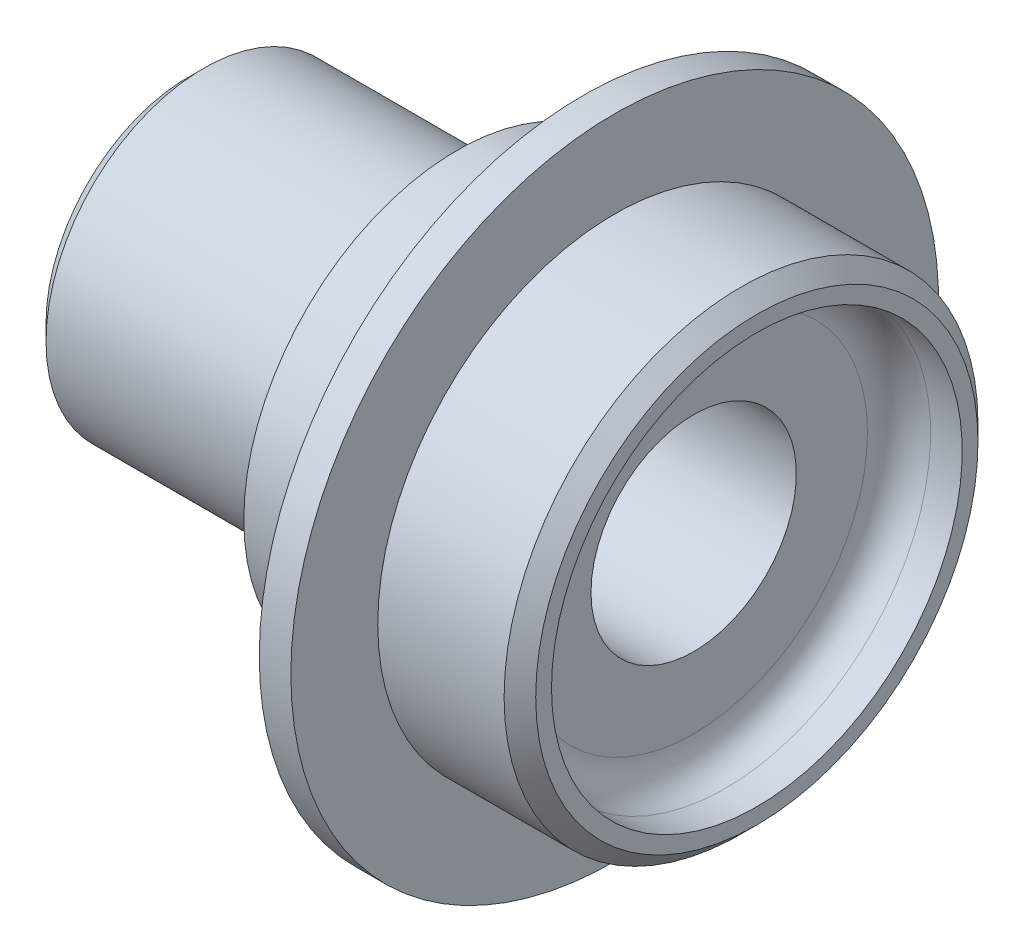
ISO-10303-21;
HEADER;
FILE_DESCRIPTION(('STEP AP214'),'2;1');
FILE_NAME('part.step','',(''),(''),'','','');
FILE_SCHEMA(('AUTOMOTIVE_DESIGN { 1 0 10303 214 1 1 1 1 }'));
ENDSEC;
DATA;
#1=APPLICATION_CONTEXT('core data for automotive mechanical design processes');
#2=APPLICATION_PROTOCOL_DEFINITION('international standard','automotive_design',2000,#1);
#3=PRODUCT_CONTEXT('',#1,'mechanical');
#4=PRODUCT('Part','Part','',(#3));
#5=PRODUCT_RELATED_PRODUCT_CATEGORY('part','',(#4));
#6=PRODUCT_DEFINITION_FORMATION('','',#4);
#7=PRODUCT_DEFINITION_CONTEXT('part definition',#1,'design');
#8=PRODUCT_DEFINITION('design','',#6,#7);
#9=PRODUCT_DEFINITION_SHAPE('','',#8);
#10=(LENGTH_UNIT() NAMED_UNIT(*) SI_UNIT(.MILLI.,.METRE.));
#11=(NAMED_UNIT(*) PLANE_ANGLE_UNIT() SI_UNIT($,.RADIAN.));
#12=(NAMED_UNIT(*) SI_UNIT($,.STERADIAN.) SOLID_ANGLE_UNIT());
#13=UNCERTAINTY_MEASURE_WITH_UNIT(LENGTH_MEASURE(1.E-05),#10,'distance_accuracy_value','');
#14=(GEOMETRIC_REPRESENTATION_CONTEXT(3) GLOBAL_UNCERTAINTY_ASSIGNED_CONTEXT((#13)) GLOBAL_UNIT_ASSIGNED_CONTEXT((#10,
#11,#12)) REPRESENTATION_CONTEXT('',''));
#15=CARTESIAN_POINT('',(0.,0.,0.));
#16=DIRECTION('',(0.,0.,1.));
#17=DIRECTION('',(1.,0.,0.));
#18=AXIS2_PLACEMENT_3D('',#15,#16,#17);
#19=CARTESIAN_POINT('',(0.,0.,0.));
#20=DIRECTION('',(-1.,0.,0.));
#21=DIRECTION('',(0.,0.,1.));
#22=AXIS2_PLACEMENT_3D('',#19,#20,#21);
#23=CYLINDRICAL_SURFACE('',#22,8.);
#24=CARTESIAN_POINT('',(10.,0.,0.));
#25=DIRECTION('',(-1.,0.,0.));
#26=DIRECTION('',(0.,0.,1.));
#27=AXIS2_PLACEMENT_3D('',#24,#25,#26);
#28=CIRCLE('',#27,8.);
#29=CARTESIAN_POINT('',(10.,0.,8.));
#30=VERTEX_POINT('',#29);
#31=EDGE_CURVE('E66',#30,#30,#28,.T.);
#32=ORIENTED_EDGE('',*,*,#31,.F.);
#33=EDGE_LOOP('',(#32));
#34=FACE_BOUND('',#33,.T.);
#35=CARTESIAN_POINT('',(0.,0.,0.));
#36=DIRECTION('',(-1.,0.,0.));
#37=DIRECTION('',(0.,0.,1.));
#38=AXIS2_PLACEMENT_3D('',#35,#36,#37);
#39=CIRCLE('',#38,8.);
#40=CARTESIAN_POINT('',(0.,0.,8.));
#41=VERTEX_POINT('',#40);
#42=EDGE_CURVE('E122',#41,#41,#39,.T.);
#43=ORIENTED_EDGE('',*,*,#42,.T.);
#44=EDGE_LOOP('',(#43));
#45=FACE_BOUND('',#44,.T.);
#46=ADVANCED_FACE('F41',(#34,#45),#23,.F.);
#47=CARTESIAN_POINT('',(10.,5.5,0.));
#48=DIRECTION('',(1.,0.,0.));
#49=DIRECTION('',(0.,0.,-1.));
#50=AXIS2_PLACEMENT_3D('',#47,#48,#49);
#51=PLANE('',#50);
#52=CARTESIAN_POINT('',(10.,0.,0.));
#53=DIRECTION('',(-1.,0.,0.));
#54=DIRECTION('',(0.,0.,1.));
#55=AXIS2_PLACEMENT_3D('',#52,#53,#54);
#56=CIRCLE('',#55,5.5);
#57=CARTESIAN_POINT('',(10.,0.,5.5));
#58=VERTEX_POINT('',#57);
#59=EDGE_CURVE('E70',#58,#58,#56,.T.);
#60=ORIENTED_EDGE('',*,*,#59,.F.);
#61=EDGE_LOOP('',(#60));
#62=FACE_BOUND('',#61,.T.);
#63=ORIENTED_EDGE('',*,*,#31,.T.);
#64=EDGE_LOOP('',(#63));
#65=FACE_BOUND('',#64,.T.);
#66=ADVANCED_FACE('F143',(#62,#65),#51,.F.);
#67=CARTESIAN_POINT('',(0.,0.,0.));
#68=DIRECTION('',(-1.,0.,0.));
#69=DIRECTION('',(0.,0.,1.));
#70=AXIS2_PLACEMENT_3D('',#67,#68,#69);
#71=CYLINDRICAL_SURFACE('',#70,5.5);
#72=CARTESIAN_POINT('',(12.,0.,0.));
#73=DIRECTION('',(-1.,0.,0.));
#74=DIRECTION('',(0.,0.,1.));
#75=AXIS2_PLACEMENT_3D('',#72,#73,#74);
#76=CIRCLE('',#75,5.5);
#77=CARTESIAN_POINT('',(12.,0.,5.5));
#78=VERTEX_POINT('',#77);
#79=EDGE_CURVE('E74',#78,#78,#76,.T.);
#80=ORIENTED_EDGE('',*,*,#79,.F.);
#81=EDGE_LOOP('',(#80));
#82=FACE_BOUND('',#81,.T.);
#83=ORIENTED_EDGE('',*,*,#59,.T.);
#84=EDGE_LOOP('',(#83));
#85=FACE_BOUND('',#84,.T.);
#86=ADVANCED_FACE('F149',(#82,#85),#71,.F.);
#87=CARTESIAN_POINT('',(12.,6.5,0.));
#88=DIRECTION('',(-1.,0.,0.));
#89=DIRECTION('',(0.,0.,1.));
#90=AXIS2_PLACEMENT_3D('',#87,#88,#89);
#91=PLANE('',#90);
#92=CARTESIAN_POINT('',(12.,0.,0.));
#93=DIRECTION('',(-1.,0.,0.));
#94=DIRECTION('',(0.,0.,1.));
#95=AXIS2_PLACEMENT_3D('',#92,#93,#94);
#96=CIRCLE('',#95,6.5);
#97=CARTESIAN_POINT('',(12.,0.,6.5));
#98=VERTEX_POINT('',#97);
#99=EDGE_CURVE('E78',#98,#98,#96,.T.);
#100=ORIENTED_EDGE('',*,*,#99,.F.);
#101=EDGE_LOOP('',(#100));
#102=FACE_BOUND('',#101,.T.);
#103=ORIENTED_EDGE('',*,*,#79,.T.);
#104=EDGE_LOOP('',(#103));
#105=FACE_BOUND('',#104,.T.);
#106=ADVANCED_FACE('F161',(#102,#105),#91,.F.);
#107=CARTESIAN_POINT('',(0.,0.,0.));
#108=DIRECTION('',(-1.,0.,0.));
#109=DIRECTION('',(0.,0.,1.));
#110=AXIS2_PLACEMENT_3D('',#107,#108,#109);
#111=CYLINDRICAL_SURFACE('',#110,6.5);
#112=CARTESIAN_POINT('',(32.,0.,0.));
#113=DIRECTION('',(-1.,0.,0.));
#114=DIRECTION('',(0.,0.,1.));
#115=AXIS2_PLACEMENT_3D('',#112,#113,#114);
#116=CIRCLE('',#115,6.5);
#117=CARTESIAN_POINT('',(32.,0.,6.5));
#118=VERTEX_POINT('',#117);
#119=EDGE_CURVE('E82',#118,#118,#116,.T.);
#120=ORIENTED_EDGE('',*,*,#119,.F.);
#121=EDGE_LOOP('',(#120));
#122=FACE_BOUND('',#121,.T.);
#123=ORIENTED_EDGE('',*,*,#99,.T.);
#124=EDGE_LOOP('',(#123));
#125=FACE_BOUND('',#124,.T.);
#126=ADVANCED_FACE('F165',(#122,#125),#111,.F.);
#127=CARTESIAN_POINT('',(32.,11.,0.));
#128=DIRECTION('',(-1.,0.,0.));
#129=DIRECTION('',(0.,0.,1.));
#130=AXIS2_PLACEMENT_3D('',#127,#128,#129);
#131=PLANE('',#130);
#132=CARTESIAN_POINT('',(32.,0.,0.));
#133=DIRECTION('',(-1.,0.,0.));
#134=DIRECTION('',(0.,0.,1.));
#135=AXIS2_PLACEMENT_3D('',#132,#133,#134);
#136=CIRCLE('',#135,11.);
#137=CARTESIAN_POINT('',(32.,0.,11.));
#138=VERTEX_POINT('',#137);
#139=EDGE_CURVE('E86',#138,#138,#136,.T.);
#140=ORIENTED_EDGE('',*,*,#139,.F.);
#141=EDGE_LOOP('',(#140));
#142=FACE_BOUND('',#141,.T.);
#143=ORIENTED_EDGE('',*,*,#119,.T.);
#144=EDGE_LOOP('',(#143));
#145=FACE_BOUND('',#144,.T.);
#146=ADVANCED_FACE('F169',(#142,#145),#131,.F.);
#147=CARTESIAN_POINT('',(34.,0.,0.));
#148=DIRECTION('',(-1.,0.,0.));
#149=DIRECTION('',(0.,0.,1.));
#150=AXIS2_PLACEMENT_3D('',#147,#148,#149);
#151=TOROIDAL_SURFACE('',#150,11.,2.);
#152=CARTESIAN_POINT('',(34.,0.,0.));
#153=DIRECTION('',(-1.,0.,0.));
#154=DIRECTION('',(0.,0.,1.));
#155=AXIS2_PLACEMENT_3D('',#152,#153,#154);
#156=CIRCLE('',#155,13.);
#157=CARTESIAN_POINT('',(34.,0.,13.));
#158=VERTEX_POINT('',#157);
#159=EDGE_CURVE('E90',#158,#158,#156,.T.);
#160=ORIENTED_EDGE('',*,*,#159,.F.);
#161=EDGE_LOOP('',(#160));
#162=FACE_BOUND('',#161,.T.);
#163=ORIENTED_EDGE('',*,*,#139,.T.);
#164=EDGE_LOOP('',(#163));
#165=FACE_BOUND('',#164,.T.);
#166=ADVANCED_FACE('F173',(#162,#165),#151,.F.);
#167=CARTESIAN_POINT('',(0.,0.,0.));
#168=DIRECTION('',(-1.,0.,0.));
#169=DIRECTION('',(0.,0.,1.));
#170=AXIS2_PLACEMENT_3D('',#167,#168,#169);
#171=CYLINDRICAL_SURFACE('',#170,13.);
#172=CARTESIAN_POINT('',(36.,0.,0.));
#173=DIRECTION('',(-1.,0.,0.));
#174=DIRECTION('',(0.,0.,1.));
#175=AXIS2_PLACEMENT_3D('',#172,#173,#174);
#176=CIRCLE('',#175,13.);
#177=CARTESIAN_POINT('',(36.,0.,13.));
#178=VERTEX_POINT('',#177);
#179=EDGE_CURVE('E94',#178,#178,#176,.T.);
#180=ORIENTED_EDGE('',*,*,#179,.F.);
#181=EDGE_LOOP('',(#180));
#182=FACE_BOUND('',#181,.T.);
#183=ORIENTED_EDGE('',*,*,#159,.T.);
#184=EDGE_LOOP('',(#183));
#185=FACE_BOUND('',#184,.T.);
#186=ADVANCED_FACE('F177',(#182,#185),#171,.F.);
#187=CARTESIAN_POINT('',(36.,15.,0.));
#188=DIRECTION('',(-1.,0.,0.));
#189=DIRECTION('',(0.,0.,1.));
#190=AXIS2_PLACEMENT_3D('',#187,#188,#189);
#191=PLANE('',#190);
#192=CARTESIAN_POINT('',(36.,0.,0.));
#193=DIRECTION('',(-1.,0.,0.));
#194=DIRECTION('',(0.,0.,1.));
#195=AXIS2_PLACEMENT_3D('',#192,#193,#194);
#196=CIRCLE('',#195,14.);
#197=CARTESIAN_POINT('',(36.,0.,14.));
#198=VERTEX_POINT('',#197);
#199=EDGE_CURVE('E10',#198,#198,#196,.F.);
#200=ORIENTED_EDGE('',*,*,#199,.T.);
#201=EDGE_LOOP('',(#200));
#202=FACE_BOUND('',#201,.T.);
#203=ORIENTED_EDGE('',*,*,#179,.T.);
#204=EDGE_LOOP('',(#203));
#205=FACE_BOUND('',#204,.T.);
#206=ADVANCED_FACE('F181',(#202,#205),#191,.F.);
#207=CARTESIAN_POINT('',(0.,0.,0.));
#208=DIRECTION('',(-1.,0.,0.));
#209=DIRECTION('',(0.,0.,1.));
#210=AXIS2_PLACEMENT_3D('',#207,#208,#209);
#211=CYLINDRICAL_SURFACE('',#210,15.);
#212=CARTESIAN_POINT('',(35.,0.,0.));
#213=DIRECTION('',(-1.,0.,0.));
#214=DIRECTION('',(0.,0.,1.));
#215=AXIS2_PLACEMENT_3D('',#212,#213,#214);
#216=CIRCLE('',#215,15.);
#217=CARTESIAN_POINT('',(35.,0.,15.));
#218=VERTEX_POINT('',#217);
#219=EDGE_CURVE('E50',#218,#218,#216,.T.);
#220=ORIENTED_EDGE('',*,*,#219,.T.);
#221=EDGE_LOOP('',(#220));
#222=FACE_BOUND('',#221,.T.);
#223=CARTESIAN_POINT('',(27.,0.,0.));
#224=DIRECTION('',(-1.,0.,0.));
#225=DIRECTION('',(0.,0.,1.));
#226=AXIS2_PLACEMENT_3D('',#223,#224,#225);
#227=CIRCLE('',#226,15.);
#228=CARTESIAN_POINT('',(27.,0.,15.));
#229=VERTEX_POINT('',#228);
#230=EDGE_CURVE('E98',#229,#229,#227,.T.);
#231=ORIENTED_EDGE('',*,*,#230,.F.);
#232=EDGE_LOOP('',(#231));
#233=FACE_BOUND('',#232,.T.);
#234=ADVANCED_FACE('F185',(#222,#233),#211,.T.);
#235=CARTESIAN_POINT('',(27.,20.5,0.));
#236=DIRECTION('',(-1.,0.,0.));
#237=DIRECTION('',(0.,0.,1.));
#238=AXIS2_PLACEMENT_3D('',#235,#236,#237);
#239=PLANE('',#238);
#240=CARTESIAN_POINT('',(27.,0.,0.));
#241=DIRECTION('',(-1.,0.,0.));
#242=DIRECTION('',(0.,0.,1.));
#243=AXIS2_PLACEMENT_3D('',#240,#241,#242);
#244=CIRCLE('',#243,20.5);
#245=CARTESIAN_POINT('',(27.,0.,20.5));
#246=VERTEX_POINT('',#245);
#247=EDGE_CURVE('E102',#246,#246,#244,.T.);
#248=ORIENTED_EDGE('',*,*,#247,.F.);
#249=EDGE_LOOP('',(#248));
#250=FACE_BOUND('',#249,.T.);
#251=ORIENTED_EDGE('',*,*,#230,.T.);
#252=EDGE_LOOP('',(#251));
#253=FACE_BOUND('',#252,.T.);
#254=ADVANCED_FACE('F188',(#250,#253),#239,.F.);
#255=CARTESIAN_POINT('',(0.,0.,0.));
#256=DIRECTION('',(-1.,0.,0.));
#257=DIRECTION('',(0.,0.,1.));
#258=AXIS2_PLACEMENT_3D('',#255,#256,#257);
#259=CYLINDRICAL_SURFACE('',#258,20.5);
#260=CARTESIAN_POINT('',(25.,0.,0.));
#261=DIRECTION('',(-1.,0.,0.));
#262=DIRECTION('',(0.,0.,1.));
#263=AXIS2_PLACEMENT_3D('',#260,#261,#262);
#264=CIRCLE('',#263,20.5);
#265=CARTESIAN_POINT('',(25.,0.,20.5));
#266=VERTEX_POINT('',#265);
#267=EDGE_CURVE('E106',#266,#266,#264,.T.);
#268=ORIENTED_EDGE('',*,*,#267,.F.);
#269=EDGE_LOOP('',(#268));
#270=FACE_BOUND('',#269,.T.);
#271=ORIENTED_EDGE('',*,*,#247,.T.);
#272=EDGE_LOOP('',(#271));
#273=FACE_BOUND('',#272,.T.);
#274=ADVANCED_FACE('F191',(#270,#273),#259,.T.);
#275=CARTESIAN_POINT('',(25.,13.5,0.));
#276=DIRECTION('',(1.,0.,0.));
#277=DIRECTION('',(0.,0.,-1.));
#278=AXIS2_PLACEMENT_3D('',#275,#276,#277);
#279=PLANE('',#278);
#280=CARTESIAN_POINT('',(25.,0.,0.));
#281=DIRECTION('',(-1.,0.,0.));
#282=DIRECTION('',(0.,0.,1.));
#283=AXIS2_PLACEMENT_3D('',#280,#281,#282);
#284=CIRCLE('',#283,13.5);
#285=CARTESIAN_POINT('',(25.,0.,13.5));
#286=VERTEX_POINT('',#285);
#287=EDGE_CURVE('E110',#286,#286,#284,.T.);
#288=ORIENTED_EDGE('',*,*,#287,.F.);
#289=EDGE_LOOP('',(#288));
#290=FACE_BOUND('',#289,.T.);
#291=ORIENTED_EDGE('',*,*,#267,.T.);
#292=EDGE_LOOP('',(#291));
#293=FACE_BOUND('',#292,.T.);
#294=ADVANCED_FACE('F195',(#290,#293),#279,.F.);
#295=CARTESIAN_POINT('',(0.,0.,0.));
#296=DIRECTION('',(-1.,0.,0.));
#297=DIRECTION('',(0.,0.,1.));
#298=AXIS2_PLACEMENT_3D('',#295,#296,#297);
#299=CYLINDRICAL_SURFACE('',#298,13.5);
#300=CARTESIAN_POINT('',(17.0207259421637,0.,0.));
#301=DIRECTION('',(-1.,0.,0.));
#302=DIRECTION('',(0.,0.,1.));
#303=AXIS2_PLACEMENT_3D('',#300,#301,#302);
#304=CIRCLE('',#303,13.5);
#305=CARTESIAN_POINT('',(17.0207259421637,0.,13.5));
#306=VERTEX_POINT('',#305);
#307=EDGE_CURVE('E114',#306,#306,#304,.T.);
#308=ORIENTED_EDGE('',*,*,#307,.F.);
#309=EDGE_LOOP('',(#308));
#310=FACE_BOUND('',#309,.T.);
#311=ORIENTED_EDGE('',*,*,#287,.T.);
#312=EDGE_LOOP('',(#311));
#313=FACE_BOUND('',#312,.T.);
#314=ADVANCED_FACE('F199',(#310,#313),#299,.T.);
#315=CARTESIAN_POINT('',(17.0207259421637,0.,0.));
#316=DIRECTION('',(1.,0.,0.));
#317=DIRECTION('',(0.,0.,-1.));
#318=AXIS2_PLACEMENT_3D('',#315,#316,#317);
#319=CONICAL_SURFACE('',#318,13.5,1.0471975511966);
#320=CARTESIAN_POINT('',(15.,0.,0.));
#321=DIRECTION('',(-1.,0.,0.));
#322=DIRECTION('',(0.,0.,1.));
#323=AXIS2_PLACEMENT_3D('',#320,#321,#322);
#324=CIRCLE('',#323,10.);
#325=CARTESIAN_POINT('',(15.,0.,10.));
#326=VERTEX_POINT('',#325);
#327=EDGE_CURVE('E118',#326,#326,#324,.T.);
#328=ORIENTED_EDGE('',*,*,#327,.F.);
#329=EDGE_LOOP('',(#328));
#330=FACE_BOUND('',#329,.T.);
#331=ORIENTED_EDGE('',*,*,#307,.T.);
#332=EDGE_LOOP('',(#331));
#333=FACE_BOUND('',#332,.T.);
#334=ADVANCED_FACE('F139',(#330,#333),#319,.T.);
#335=CARTESIAN_POINT('',(0.,0.,0.));
#336=DIRECTION('',(-1.,0.,0.));
#337=DIRECTION('',(0.,0.,1.));
#338=AXIS2_PLACEMENT_3D('',#335,#336,#337);
#339=CYLINDRICAL_SURFACE('',#338,10.);
#340=CARTESIAN_POINT('',(1.00000000000001,0.,0.));
#341=DIRECTION('',(1.,0.,0.));
#342=DIRECTION('',(0.,0.,-1.));
#343=AXIS2_PLACEMENT_3D('',#340,#341,#342);
#344=CIRCLE('',#343,10.);
#345=CARTESIAN_POINT('',(1.00000000000001,0.,-10.));
#346=VERTEX_POINT('',#345);
#347=EDGE_CURVE('E55',#346,#346,#344,.T.);
#348=ORIENTED_EDGE('',*,*,#347,.T.);
#349=EDGE_LOOP('',(#348));
#350=FACE_BOUND('',#349,.T.);
#351=ORIENTED_EDGE('',*,*,#327,.T.);
#352=EDGE_LOOP('',(#351));
#353=FACE_BOUND('',#352,.T.);
#354=ADVANCED_FACE('F131',(#350,#353),#339,.T.);
#355=CARTESIAN_POINT('',(0.,8.,0.));
#356=DIRECTION('',(1.,0.,0.));
#357=DIRECTION('',(0.,0.,-1.));
#358=AXIS2_PLACEMENT_3D('',#355,#356,#357);
#359=PLANE('',#358);
#360=CARTESIAN_POINT('',(0.,0.,0.));
#361=DIRECTION('',(1.,0.,0.));
#362=DIRECTION('',(0.,0.,-1.));
#363=AXIS2_PLACEMENT_3D('',#360,#361,#362);
#364=CIRCLE('',#363,8.99999999999999);
#365=CARTESIAN_POINT('',(0.,0.,-8.99999999999999));
#366=VERTEX_POINT('',#365);
#367=EDGE_CURVE('E60',#366,#366,#364,.F.);
#368=ORIENTED_EDGE('',*,*,#367,.T.);
#369=EDGE_LOOP('',(#368));
#370=FACE_BOUND('',#369,.T.);
#371=ORIENTED_EDGE('',*,*,#42,.F.);
#372=EDGE_LOOP('',(#371));
#373=FACE_BOUND('',#372,.T.);
#374=ADVANCED_FACE('F128',(#370,#373),#359,.F.);
#375=CARTESIAN_POINT('',(0.,0.,0.));
#376=DIRECTION('',(1.,0.,0.));
#377=DIRECTION('',(0.,0.,-1.));
#378=AXIS2_PLACEMENT_3D('',#375,#376,#377);
#379=CONICAL_SURFACE('',#378,8.99999999999999,0.785398163397445);
#380=ORIENTED_EDGE('',*,*,#347,.F.);
#381=EDGE_LOOP('',(#380));
#382=FACE_BOUND('',#381,.T.);
#383=ORIENTED_EDGE('',*,*,#367,.F.);
#384=EDGE_LOOP('',(#383));
#385=FACE_BOUND('',#384,.T.);
#386=ADVANCED_FACE('F130',(#382,#385),#379,.T.);
#387=CARTESIAN_POINT('',(35.,0.,0.));
#388=DIRECTION('',(-1.,0.,0.));
#389=DIRECTION('',(0.,0.,1.));
#390=AXIS2_PLACEMENT_3D('',#387,#388,#389);
#391=CONICAL_SURFACE('',#390,15.,0.785398163397455);
#392=ORIENTED_EDGE('',*,*,#199,.F.);
#393=EDGE_LOOP('',(#392));
#394=FACE_BOUND('',#393,.T.);
#395=ORIENTED_EDGE('',*,*,#219,.F.);
#396=EDGE_LOOP('',(#395));
#397=FACE_BOUND('',#396,.T.);
#398=ADVANCED_FACE('F44',(#394,#397),#391,.T.);
#399=CLOSED_SHELL('',(#46,#66,#86,#106,#126,#146,#166,#186,#206,#234,#254,#274,#294,#314,#334,
#354,#374,#386,#398));
#400=MANIFOLD_SOLID_BREP('B2',#399);
#401=ADVANCED_BREP_SHAPE_REPRESENTATION('',(#18,#400),#14);
#402=SHAPE_DEFINITION_REPRESENTATION(#9,#401);
ENDSEC;
END-ISO-10303-21;
